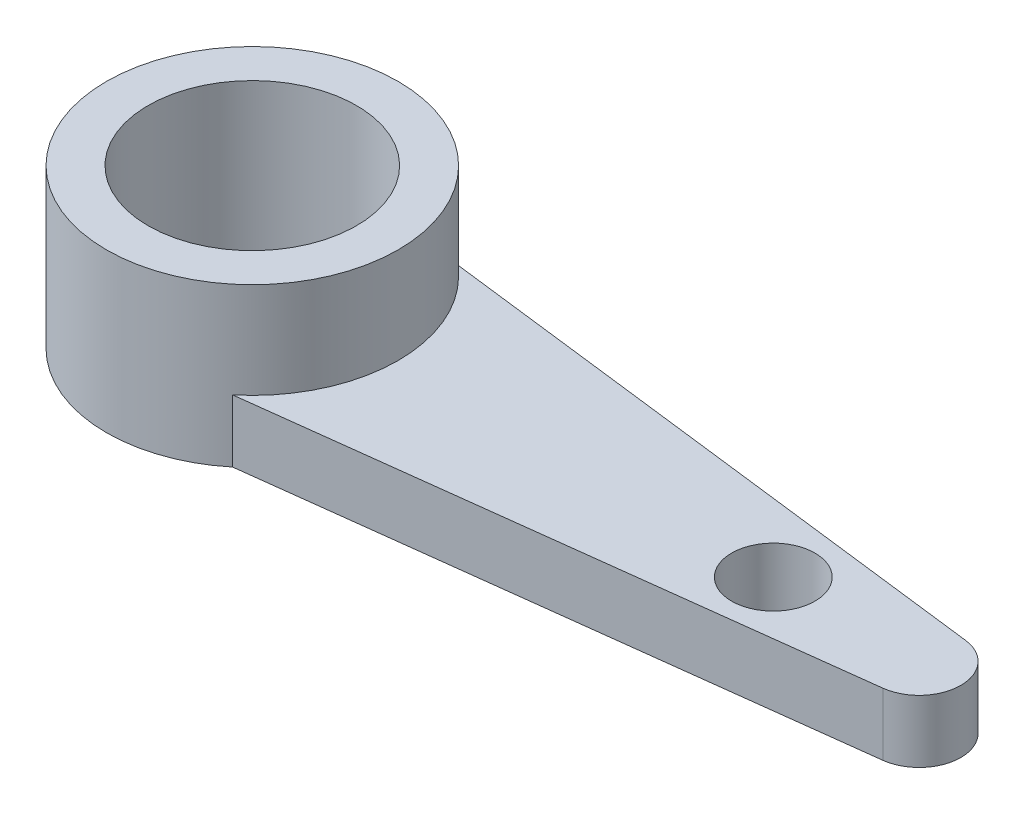
ISO-10303-21;
HEADER;
FILE_DESCRIPTION(('STEP AP214'),'2;1');
FILE_NAME('part.step','',(''),(''),'','','');
FILE_SCHEMA(('AUTOMOTIVE_DESIGN { 1 0 10303 214 1 1 1 1 }'));
ENDSEC;
DATA;
#1=APPLICATION_CONTEXT('core data for automotive mechanical design processes');
#2=APPLICATION_PROTOCOL_DEFINITION('international standard','automotive_design',2000,#1);
#3=PRODUCT_CONTEXT('',#1,'mechanical');
#4=PRODUCT('Part','Part','',(#3));
#5=PRODUCT_RELATED_PRODUCT_CATEGORY('part','',(#4));
#6=PRODUCT_DEFINITION_FORMATION('','',#4);
#7=PRODUCT_DEFINITION_CONTEXT('part definition',#1,'design');
#8=PRODUCT_DEFINITION('design','',#6,#7);
#9=PRODUCT_DEFINITION_SHAPE('','',#8);
#10=(LENGTH_UNIT() NAMED_UNIT(*) SI_UNIT(.MILLI.,.METRE.));
#11=(NAMED_UNIT(*) PLANE_ANGLE_UNIT() SI_UNIT($,.RADIAN.));
#12=(NAMED_UNIT(*) SI_UNIT($,.STERADIAN.) SOLID_ANGLE_UNIT());
#13=UNCERTAINTY_MEASURE_WITH_UNIT(LENGTH_MEASURE(1.E-05),#10,'distance_accuracy_value','');
#14=(GEOMETRIC_REPRESENTATION_CONTEXT(3) GLOBAL_UNCERTAINTY_ASSIGNED_CONTEXT((#13)) GLOBAL_UNIT_ASSIGNED_CONTEXT((#10,
#11,#12)) REPRESENTATION_CONTEXT('',''));
#15=CARTESIAN_POINT('',(0.,0.,0.));
#16=DIRECTION('',(0.,0.,1.));
#17=DIRECTION('',(1.,0.,0.));
#18=AXIS2_PLACEMENT_3D('',#15,#16,#17);
#19=CARTESIAN_POINT('',(0.,1.5,0.));
#20=DIRECTION('',(0.,1.,0.));
#21=DIRECTION('',(0.,0.,1.));
#22=AXIS2_PLACEMENT_3D('',#19,#20,#21);
#23=PLANE('',#22);
#24=CARTESIAN_POINT('',(12.5,1.5,0.));
#25=DIRECTION('',(0.,1.,0.));
#26=DIRECTION('',(0.,0.,1.));
#27=AXIS2_PLACEMENT_3D('',#24,#25,#26);
#28=CIRCLE('',#27,1.);
#29=CARTESIAN_POINT('',(12.5,1.5,1.));
#30=VERTEX_POINT('',#29);
#31=EDGE_CURVE('E101',#30,#30,#28,.F.);
#32=ORIENTED_EDGE('',*,*,#31,.T.);
#33=EDGE_LOOP('',(#32));
#34=FACE_BOUND('',#33,.T.);
#35=DIRECTION('',(0.99253412443653,0.,0.12196725720049));
#36=VECTOR('',#35,1.);
#37=CARTESIAN_POINT('',(0.359983446464656,1.5,-2.92944076180314));
#38=LINE('',#37,#36);
#39=CARTESIAN_POINT('',(2.22710574513201,1.5,-2.7));
#40=VERTEX_POINT('',#39);
#41=CARTESIAN_POINT('',(16.1219672572005,1.5,-0.992534124436531));
#42=VERTEX_POINT('',#41);
#43=EDGE_CURVE('E89',#40,#42,#38,.T.);
#44=ORIENTED_EDGE('',*,*,#43,.F.);
#45=CARTESIAN_POINT('',(0.,1.5,0.));
#46=DIRECTION('',(0.,1.,0.));
#47=DIRECTION('',(0.,0.,1.));
#48=AXIS2_PLACEMENT_3D('',#45,#46,#47);
#49=CIRCLE('',#48,3.5);
#50=CARTESIAN_POINT('',(2.22710574513201,1.5,2.7));
#51=VERTEX_POINT('',#50);
#52=EDGE_CURVE('E80',#40,#51,#49,.F.);
#53=ORIENTED_EDGE('',*,*,#52,.T.);
#54=DIRECTION('',(0.99253412443653,0.,-0.12196725720049));
#55=VECTOR('',#54,1.);
#56=CARTESIAN_POINT('',(0.359983446464656,1.5,2.92944076180314));
#57=LINE('',#56,#55);
#58=CARTESIAN_POINT('',(16.1219672572005,1.5,0.992534124436531));
#59=VERTEX_POINT('',#58);
#60=EDGE_CURVE('E75',#51,#59,#57,.T.);
#61=ORIENTED_EDGE('',*,*,#60,.T.);
#62=CARTESIAN_POINT('',(16.,1.5,0.));
#63=DIRECTION('',(0.,1.,0.));
#64=DIRECTION('',(0.,0.,1.));
#65=AXIS2_PLACEMENT_3D('',#62,#63,#64);
#66=CIRCLE('',#65,1.);
#67=EDGE_CURVE('E86',#59,#42,#66,.T.);
#68=ORIENTED_EDGE('',*,*,#67,.T.);
#69=EDGE_LOOP('',(#44,#53,#61,#68));
#70=FACE_BOUND('',#69,.T.);
#71=ADVANCED_FACE('F32',(#34,#70),#23,.T.);
#72=CARTESIAN_POINT('',(0.,1.5,0.));
#73=DIRECTION('',(0.,-1.,0.));
#74=DIRECTION('',(0.,0.,-1.));
#75=AXIS2_PLACEMENT_3D('',#72,#73,#74);
#76=CYLINDRICAL_SURFACE('',#75,3.5);
#77=CARTESIAN_POINT('',(0.,0.,0.));
#78=DIRECTION('',(0.,1.,0.));
#79=DIRECTION('',(0.,0.,1.));
#80=AXIS2_PLACEMENT_3D('',#77,#78,#79);
#81=CIRCLE('',#80,3.5);
#82=CARTESIAN_POINT('',(2.22710574513201,0.,-2.7));
#83=VERTEX_POINT('',#82);
#84=CARTESIAN_POINT('',(2.22710574513201,0.,2.7));
#85=VERTEX_POINT('',#84);
#86=EDGE_CURVE('E81',#83,#85,#81,.T.);
#87=ORIENTED_EDGE('',*,*,#86,.T.);
#88=DIRECTION('',(0.,-1.,0.));
#89=VECTOR('',#88,1.);
#90=CARTESIAN_POINT('',(2.22710574513201,1.5,2.7));
#91=LINE('',#90,#89);
#92=EDGE_CURVE('E11',#51,#85,#91,.T.);
#93=ORIENTED_EDGE('',*,*,#92,.F.);
#94=ORIENTED_EDGE('',*,*,#52,.F.);
#95=DIRECTION('',(0.,-1.,0.));
#96=VECTOR('',#95,1.);
#97=CARTESIAN_POINT('',(2.22710574513201,1.5,-2.7));
#98=LINE('',#97,#96);
#99=EDGE_CURVE('E49',#40,#83,#98,.T.);
#100=ORIENTED_EDGE('',*,*,#99,.T.);
#101=EDGE_LOOP('',(#87,#93,#94,#100));
#102=FACE_BOUND('',#101,.T.);
#103=CARTESIAN_POINT('',(0.,3.8,0.));
#104=DIRECTION('',(0.,1.,0.));
#105=DIRECTION('',(0.,0.,1.));
#106=AXIS2_PLACEMENT_3D('',#103,#104,#105);
#107=CIRCLE('',#106,3.5);
#108=CARTESIAN_POINT('',(0.,3.8,3.5));
#109=VERTEX_POINT('',#108);
#110=EDGE_CURVE('E95',#109,#109,#107,.T.);
#111=ORIENTED_EDGE('',*,*,#110,.F.);
#112=EDGE_LOOP('',(#111));
#113=FACE_BOUND('',#112,.T.);
#114=ADVANCED_FACE('F34',(#102,#113),#76,.T.);
#115=CARTESIAN_POINT('',(0.359983446464656,1.5,2.92944076180314));
#116=DIRECTION('',(-0.12196725720049,0.,-0.99253412443653));
#117=DIRECTION('',(-0.99253412443653,0.,0.12196725720049));
#118=AXIS2_PLACEMENT_3D('',#115,#116,#117);
#119=PLANE('',#118);
#120=DIRECTION('',(0.99253412443653,0.,-0.12196725720049));
#121=VECTOR('',#120,1.);
#122=CARTESIAN_POINT('',(0.359983446464656,0.,2.92944076180314));
#123=LINE('',#122,#121);
#124=CARTESIAN_POINT('',(16.1219672572005,0.,0.992534124436531));
#125=VERTEX_POINT('',#124);
#126=EDGE_CURVE('E92',#85,#125,#123,.T.);
#127=ORIENTED_EDGE('',*,*,#126,.T.);
#128=DIRECTION('',(0.,-1.,0.));
#129=VECTOR('',#128,1.);
#130=CARTESIAN_POINT('',(16.1219672572005,1.5,0.992534124436531));
#131=LINE('',#130,#129);
#132=EDGE_CURVE('E41',#59,#125,#131,.T.);
#133=ORIENTED_EDGE('',*,*,#132,.F.);
#134=ORIENTED_EDGE('',*,*,#60,.F.);
#135=ORIENTED_EDGE('',*,*,#92,.T.);
#136=EDGE_LOOP('',(#127,#133,#134,#135));
#137=FACE_BOUND('',#136,.T.);
#138=ADVANCED_FACE('F83',(#137),#119,.F.);
#139=CARTESIAN_POINT('',(16.,1.5,0.));
#140=DIRECTION('',(0.,-1.,0.));
#141=DIRECTION('',(0.,0.,-1.));
#142=AXIS2_PLACEMENT_3D('',#139,#140,#141);
#143=CYLINDRICAL_SURFACE('',#142,1.);
#144=CARTESIAN_POINT('',(16.,0.,0.));
#145=DIRECTION('',(0.,1.,0.));
#146=DIRECTION('',(0.,0.,1.));
#147=AXIS2_PLACEMENT_3D('',#144,#145,#146);
#148=CIRCLE('',#147,1.);
#149=CARTESIAN_POINT('',(16.1219672572005,0.,-0.992534124436531));
#150=VERTEX_POINT('',#149);
#151=EDGE_CURVE('E105',#125,#150,#148,.T.);
#152=ORIENTED_EDGE('',*,*,#151,.T.);
#153=DIRECTION('',(0.,-1.,0.));
#154=VECTOR('',#153,1.);
#155=CARTESIAN_POINT('',(16.1219672572005,1.5,-0.992534124436531));
#156=LINE('',#155,#154);
#157=EDGE_CURVE('E65',#42,#150,#156,.T.);
#158=ORIENTED_EDGE('',*,*,#157,.F.);
#159=ORIENTED_EDGE('',*,*,#67,.F.);
#160=ORIENTED_EDGE('',*,*,#132,.T.);
#161=EDGE_LOOP('',(#152,#158,#159,#160));
#162=FACE_BOUND('',#161,.T.);
#163=ADVANCED_FACE('F118',(#162),#143,.T.);
#164=CARTESIAN_POINT('',(0.,1.5,0.));
#165=DIRECTION('',(0.,-1.,0.));
#166=DIRECTION('',(0.,0.,-1.));
#167=AXIS2_PLACEMENT_3D('',#164,#165,#166);
#168=CYLINDRICAL_SURFACE('',#167,2.5);
#169=CARTESIAN_POINT('',(0.,0.,0.));
#170=DIRECTION('',(0.,1.,0.));
#171=DIRECTION('',(0.,0.,1.));
#172=AXIS2_PLACEMENT_3D('',#169,#170,#171);
#173=CIRCLE('',#172,2.5);
#174=CARTESIAN_POINT('',(0.,0.,2.5));
#175=VERTEX_POINT('',#174);
#176=EDGE_CURVE('E110',#175,#175,#173,.T.);
#177=ORIENTED_EDGE('',*,*,#176,.F.);
#178=EDGE_LOOP('',(#177));
#179=FACE_BOUND('',#178,.T.);
#180=CARTESIAN_POINT('',(0.,3.8,0.));
#181=DIRECTION('',(0.,1.,0.));
#182=DIRECTION('',(0.,0.,1.));
#183=AXIS2_PLACEMENT_3D('',#180,#181,#182);
#184=CIRCLE('',#183,2.5);
#185=CARTESIAN_POINT('',(0.,3.8,2.5));
#186=VERTEX_POINT('',#185);
#187=EDGE_CURVE('E90',#186,#186,#184,.T.);
#188=ORIENTED_EDGE('',*,*,#187,.T.);
#189=EDGE_LOOP('',(#188));
#190=FACE_BOUND('',#189,.T.);
#191=ADVANCED_FACE('F125',(#179,#190),#168,.F.);
#192=CARTESIAN_POINT('',(0.359983446464656,1.5,-2.92944076180314));
#193=DIRECTION('',(0.12196725720049,0.,-0.99253412443653));
#194=DIRECTION('',(-0.99253412443653,0.,-0.12196725720049));
#195=AXIS2_PLACEMENT_3D('',#192,#193,#194);
#196=PLANE('',#195);
#197=DIRECTION('',(0.99253412443653,0.,0.12196725720049));
#198=VECTOR('',#197,1.);
#199=CARTESIAN_POINT('',(0.359983446464656,0.,-2.92944076180314));
#200=LINE('',#199,#198);
#201=EDGE_CURVE('E107',#83,#150,#200,.T.);
#202=ORIENTED_EDGE('',*,*,#201,.F.);
#203=ORIENTED_EDGE('',*,*,#99,.F.);
#204=ORIENTED_EDGE('',*,*,#43,.T.);
#205=ORIENTED_EDGE('',*,*,#157,.T.);
#206=EDGE_LOOP('',(#202,#203,#204,#205));
#207=FACE_BOUND('',#206,.T.);
#208=ADVANCED_FACE('F122',(#207),#196,.T.);
#209=CARTESIAN_POINT('',(12.5,1.5,0.));
#210=DIRECTION('',(0.,-1.,0.));
#211=DIRECTION('',(0.,0.,-1.));
#212=AXIS2_PLACEMENT_3D('',#209,#210,#211);
#213=CYLINDRICAL_SURFACE('',#212,1.);
#214=ORIENTED_EDGE('',*,*,#31,.F.);
#215=EDGE_LOOP('',(#214));
#216=FACE_BOUND('',#215,.T.);
#217=CARTESIAN_POINT('',(12.5,0.,0.));
#218=DIRECTION('',(0.,1.,0.));
#219=DIRECTION('',(0.,0.,1.));
#220=AXIS2_PLACEMENT_3D('',#217,#218,#219);
#221=CIRCLE('',#220,1.);
#222=CARTESIAN_POINT('',(12.5,0.,1.));
#223=VERTEX_POINT('',#222);
#224=EDGE_CURVE('E87',#223,#223,#221,.F.);
#225=ORIENTED_EDGE('',*,*,#224,.T.);
#226=EDGE_LOOP('',(#225));
#227=FACE_BOUND('',#226,.T.);
#228=ADVANCED_FACE('F124',(#216,#227),#213,.F.);
#229=CARTESIAN_POINT('',(0.,0.,0.));
#230=DIRECTION('',(0.,1.,0.));
#231=DIRECTION('',(0.,0.,1.));
#232=AXIS2_PLACEMENT_3D('',#229,#230,#231);
#233=PLANE('',#232);
#234=ORIENTED_EDGE('',*,*,#86,.F.);
#235=ORIENTED_EDGE('',*,*,#201,.T.);
#236=ORIENTED_EDGE('',*,*,#151,.F.);
#237=ORIENTED_EDGE('',*,*,#126,.F.);
#238=EDGE_LOOP('',(#234,#235,#236,#237));
#239=FACE_BOUND('',#238,.T.);
#240=ORIENTED_EDGE('',*,*,#176,.T.);
#241=EDGE_LOOP('',(#240));
#242=FACE_BOUND('',#241,.T.);
#243=ORIENTED_EDGE('',*,*,#224,.F.);
#244=EDGE_LOOP('',(#243));
#245=FACE_BOUND('',#244,.T.);
#246=ADVANCED_FACE('F120',(#239,#242,#245),#233,.F.);
#247=CARTESIAN_POINT('',(0.,3.8,0.));
#248=DIRECTION('',(0.,1.,0.));
#249=DIRECTION('',(0.,0.,1.));
#250=AXIS2_PLACEMENT_3D('',#247,#248,#249);
#251=PLANE('',#250);
#252=ORIENTED_EDGE('',*,*,#110,.T.);
#253=EDGE_LOOP('',(#252));
#254=FACE_BOUND('',#253,.T.);
#255=ORIENTED_EDGE('',*,*,#187,.F.);
#256=EDGE_LOOP('',(#255));
#257=FACE_BOUND('',#256,.T.);
#258=ADVANCED_FACE('F144',(#254,#257),#251,.T.);
#259=CLOSED_SHELL('',(#71,#114,#138,#163,#191,#208,#228,#246,#258));
#260=MANIFOLD_SOLID_BREP('B2',#259);
#261=ADVANCED_BREP_SHAPE_REPRESENTATION('',(#18,#260),#14);
#262=SHAPE_DEFINITION_REPRESENTATION(#9,#261);
ENDSEC;
END-ISO-10303-21;
